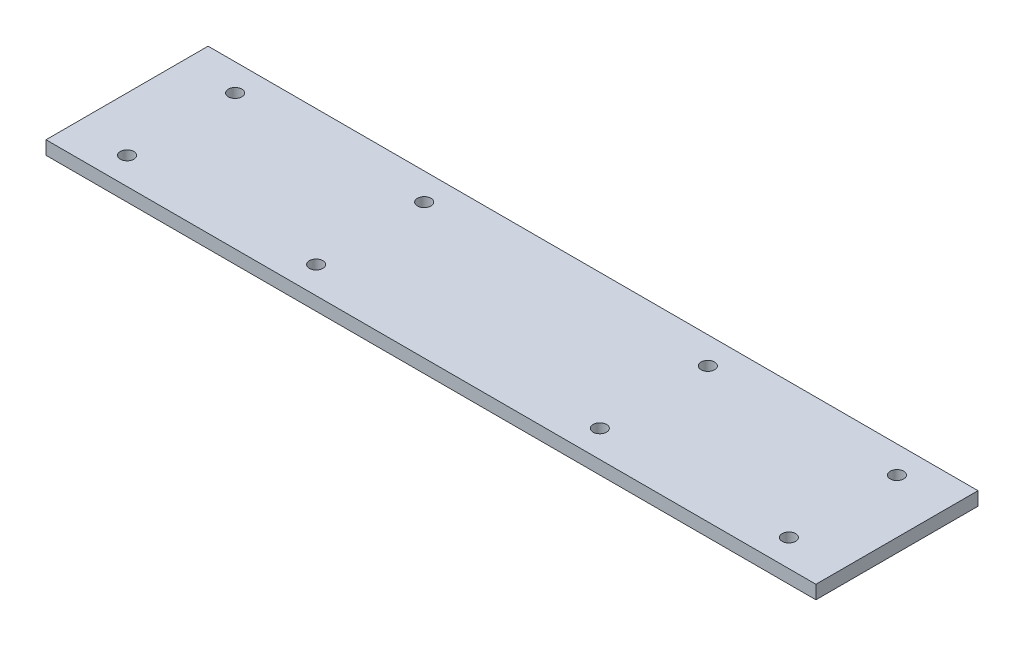
ISO-10303-21;
HEADER;
FILE_DESCRIPTION(('STEP AP214'),'2;1');
FILE_NAME('part.step','',(''),(''),'','','');
FILE_SCHEMA(('AUTOMOTIVE_DESIGN { 1 0 10303 214 1 1 1 1 }'));
ENDSEC;
DATA;
#1=APPLICATION_CONTEXT('core data for automotive mechanical design processes');
#2=APPLICATION_PROTOCOL_DEFINITION('international standard','automotive_design',2000,#1);
#3=PRODUCT_CONTEXT('',#1,'mechanical');
#4=PRODUCT('Part','Part','',(#3));
#5=PRODUCT_RELATED_PRODUCT_CATEGORY('part','',(#4));
#6=PRODUCT_DEFINITION_FORMATION('','',#4);
#7=PRODUCT_DEFINITION_CONTEXT('part definition',#1,'design');
#8=PRODUCT_DEFINITION('design','',#6,#7);
#9=PRODUCT_DEFINITION_SHAPE('','',#8);
#10=(LENGTH_UNIT() NAMED_UNIT(*) SI_UNIT(.MILLI.,.METRE.));
#11=(NAMED_UNIT(*) PLANE_ANGLE_UNIT() SI_UNIT($,.RADIAN.));
#12=(NAMED_UNIT(*) SI_UNIT($,.STERADIAN.) SOLID_ANGLE_UNIT());
#13=UNCERTAINTY_MEASURE_WITH_UNIT(LENGTH_MEASURE(1.E-05),#10,'distance_accuracy_value','');
#14=(GEOMETRIC_REPRESENTATION_CONTEXT(3) GLOBAL_UNCERTAINTY_ASSIGNED_CONTEXT((#13)) GLOBAL_UNIT_ASSIGNED_CONTEXT((#10,
#11,#12)) REPRESENTATION_CONTEXT('',''));
#15=CARTESIAN_POINT('',(0.,0.,0.));
#16=DIRECTION('',(0.,0.,1.));
#17=DIRECTION('',(1.,0.,0.));
#18=AXIS2_PLACEMENT_3D('',#15,#16,#17);
#19=CARTESIAN_POINT('',(-295.598856053384,12.7,-152.4));
#20=DIRECTION('',(1.,0.,0.));
#21=DIRECTION('',(0.,0.,-1.));
#22=AXIS2_PLACEMENT_3D('',#19,#20,#21);
#23=PLANE('',#22);
#24=DIRECTION('',(0.,0.,1.));
#25=VECTOR('',#24,1.);
#26=CARTESIAN_POINT('',(-295.598856053384,0.,-152.4));
#27=LINE('',#26,#25);
#28=CARTESIAN_POINT('',(-295.598856053384,0.,-152.4));
#29=VERTEX_POINT('',#28);
#30=CARTESIAN_POINT('',(-295.598856053384,0.,0.));
#31=VERTEX_POINT('',#30);
#32=EDGE_CURVE('E100',#29,#31,#27,.T.);
#33=ORIENTED_EDGE('',*,*,#32,.T.);
#34=DIRECTION('',(0.,-1.,0.));
#35=VECTOR('',#34,1.);
#36=CARTESIAN_POINT('',(-295.598856053384,12.7,0.));
#37=LINE('',#36,#35);
#38=CARTESIAN_POINT('',(-295.598856053384,12.7,0.));
#39=VERTEX_POINT('',#38);
#40=EDGE_CURVE('E11',#39,#31,#37,.T.);
#41=ORIENTED_EDGE('',*,*,#40,.F.);
#42=DIRECTION('',(0.,0.,1.));
#43=VECTOR('',#42,1.);
#44=CARTESIAN_POINT('',(-295.598856053384,12.7,-152.4));
#45=LINE('',#44,#43);
#46=CARTESIAN_POINT('',(-295.598856053384,12.7,-152.4));
#47=VERTEX_POINT('',#46);
#48=EDGE_CURVE('E88',#47,#39,#45,.T.);
#49=ORIENTED_EDGE('',*,*,#48,.F.);
#50=DIRECTION('',(0.,-1.,0.));
#51=VECTOR('',#50,1.);
#52=CARTESIAN_POINT('',(-295.598856053384,12.7,-152.4));
#53=LINE('',#52,#51);
#54=EDGE_CURVE('E96',#47,#29,#53,.T.);
#55=ORIENTED_EDGE('',*,*,#54,.T.);
#56=EDGE_LOOP('',(#33,#41,#49,#55));
#57=FACE_BOUND('',#56,.T.);
#58=ADVANCED_FACE('F37',(#57),#23,.F.);
#59=CARTESIAN_POINT('',(-295.598856053384,12.7,0.));
#60=DIRECTION('',(0.,0.,-1.));
#61=DIRECTION('',(-1.,0.,0.));
#62=AXIS2_PLACEMENT_3D('',#59,#60,#61);
#63=PLANE('',#62);
#64=DIRECTION('',(1.,0.,0.));
#65=VECTOR('',#64,1.);
#66=CARTESIAN_POINT('',(-295.598856053384,0.,0.));
#67=LINE('',#66,#65);
#68=CARTESIAN_POINT('',(428.301143946616,0.,0.));
#69=VERTEX_POINT('',#68);
#70=EDGE_CURVE('E92',#31,#69,#67,.T.);
#71=ORIENTED_EDGE('',*,*,#70,.T.);
#72=DIRECTION('',(0.,-1.,0.));
#73=VECTOR('',#72,1.);
#74=CARTESIAN_POINT('',(428.301143946616,12.7,0.));
#75=LINE('',#74,#73);
#76=CARTESIAN_POINT('',(428.301143946616,12.7,0.));
#77=VERTEX_POINT('',#76);
#78=EDGE_CURVE('E45',#77,#69,#75,.T.);
#79=ORIENTED_EDGE('',*,*,#78,.F.);
#80=DIRECTION('',(1.,0.,0.));
#81=VECTOR('',#80,1.);
#82=CARTESIAN_POINT('',(-295.598856053384,12.7,0.));
#83=LINE('',#82,#81);
#84=EDGE_CURVE('E83',#39,#77,#83,.T.);
#85=ORIENTED_EDGE('',*,*,#84,.F.);
#86=ORIENTED_EDGE('',*,*,#40,.T.);
#87=EDGE_LOOP('',(#71,#79,#85,#86));
#88=FACE_BOUND('',#87,.T.);
#89=ADVANCED_FACE('F91',(#88),#63,.F.);
#90=CARTESIAN_POINT('',(428.301143946616,12.7,-152.4));
#91=DIRECTION('',(-1.,0.,0.));
#92=DIRECTION('',(0.,0.,1.));
#93=AXIS2_PLACEMENT_3D('',#90,#91,#92);
#94=PLANE('',#93);
#95=DIRECTION('',(0.,0.,-1.));
#96=VECTOR('',#95,1.);
#97=CARTESIAN_POINT('',(428.301143946616,0.,-152.4));
#98=LINE('',#97,#96);
#99=CARTESIAN_POINT('',(428.301143946616,0.,-152.4));
#100=VERTEX_POINT('',#99);
#101=EDGE_CURVE('E70',#69,#100,#98,.T.);
#102=ORIENTED_EDGE('',*,*,#101,.T.);
#103=DIRECTION('',(0.,-1.,0.));
#104=VECTOR('',#103,1.);
#105=CARTESIAN_POINT('',(428.301143946616,12.7,-152.4));
#106=LINE('',#105,#104);
#107=CARTESIAN_POINT('',(428.301143946616,12.7,-152.4));
#108=VERTEX_POINT('',#107);
#109=EDGE_CURVE('E93',#108,#100,#106,.T.);
#110=ORIENTED_EDGE('',*,*,#109,.F.);
#111=DIRECTION('',(0.,0.,-1.));
#112=VECTOR('',#111,1.);
#113=CARTESIAN_POINT('',(428.301143946616,12.7,-152.4));
#114=LINE('',#113,#112);
#115=EDGE_CURVE('E86',#77,#108,#114,.T.);
#116=ORIENTED_EDGE('',*,*,#115,.F.);
#117=ORIENTED_EDGE('',*,*,#78,.T.);
#118=EDGE_LOOP('',(#102,#110,#116,#117));
#119=FACE_BOUND('',#118,.T.);
#120=ADVANCED_FACE('F94',(#119),#94,.F.);
#121=CARTESIAN_POINT('',(-295.598856053384,12.7,-152.4));
#122=DIRECTION('',(0.,0.,1.));
#123=DIRECTION('',(1.,0.,0.));
#124=AXIS2_PLACEMENT_3D('',#121,#122,#123);
#125=PLANE('',#124);
#126=DIRECTION('',(-1.,0.,0.));
#127=VECTOR('',#126,1.);
#128=CARTESIAN_POINT('',(-295.598856053384,0.,-152.4));
#129=LINE('',#128,#127);
#130=EDGE_CURVE('E76',#100,#29,#129,.T.);
#131=ORIENTED_EDGE('',*,*,#130,.T.);
#132=ORIENTED_EDGE('',*,*,#54,.F.);
#133=DIRECTION('',(-1.,0.,0.));
#134=VECTOR('',#133,1.);
#135=CARTESIAN_POINT('',(-295.598856053384,12.7,-152.4));
#136=LINE('',#135,#134);
#137=EDGE_CURVE('E53',#108,#47,#136,.T.);
#138=ORIENTED_EDGE('',*,*,#137,.F.);
#139=ORIENTED_EDGE('',*,*,#109,.T.);
#140=EDGE_LOOP('',(#131,#132,#138,#139));
#141=FACE_BOUND('',#140,.T.);
#142=ADVANCED_FACE('F108',(#141),#125,.F.);
#143=CARTESIAN_POINT('',(0.,12.7,0.));
#144=DIRECTION('',(0.,1.,0.));
#145=DIRECTION('',(0.,0.,1.));
#146=AXIS2_PLACEMENT_3D('',#143,#144,#145);
#147=PLANE('',#146);
#148=CARTESIAN_POINT('',(-244.798856053384,12.7,-127.));
#149=DIRECTION('',(0.,1.,0.));
#150=DIRECTION('',(0.,0.,-1.));
#151=AXIS2_PLACEMENT_3D('',#148,#149,#150);
#152=CIRCLE('',#151,6.34999999999994);
#153=CARTESIAN_POINT('',(-244.798856053384,12.7,-133.35));
#154=VERTEX_POINT('',#153);
#155=EDGE_CURVE('E132',#154,#154,#152,.T.);
#156=ORIENTED_EDGE('',*,*,#155,.F.);
#157=EDGE_LOOP('',(#156));
#158=FACE_BOUND('',#157,.T.);
#159=CARTESIAN_POINT('',(199.701143946616,12.7,-25.4));
#160=DIRECTION('',(0.,1.,0.));
#161=DIRECTION('',(0.,0.,1.));
#162=AXIS2_PLACEMENT_3D('',#159,#160,#161);
#163=CIRCLE('',#162,6.35);
#164=CARTESIAN_POINT('',(199.701143946616,12.7,-19.05));
#165=VERTEX_POINT('',#164);
#166=EDGE_CURVE('E139',#165,#165,#163,.T.);
#167=ORIENTED_EDGE('',*,*,#166,.F.);
#168=EDGE_LOOP('',(#167));
#169=FACE_BOUND('',#168,.T.);
#170=CARTESIAN_POINT('',(199.701143946616,12.7,-127.));
#171=DIRECTION('',(0.,1.,0.));
#172=DIRECTION('',(0.,0.,1.));
#173=AXIS2_PLACEMENT_3D('',#170,#171,#172);
#174=CIRCLE('',#173,6.34999999999994);
#175=CARTESIAN_POINT('',(199.701143946616,12.7,-120.65));
#176=VERTEX_POINT('',#175);
#177=EDGE_CURVE('E120',#176,#176,#174,.T.);
#178=ORIENTED_EDGE('',*,*,#177,.F.);
#179=EDGE_LOOP('',(#178));
#180=FACE_BOUND('',#179,.T.);
#181=CARTESIAN_POINT('',(377.501143946616,12.7,-25.4));
#182=DIRECTION('',(0.,1.,0.));
#183=DIRECTION('',(0.,0.,1.));
#184=AXIS2_PLACEMENT_3D('',#181,#182,#183);
#185=CIRCLE('',#184,6.35);
#186=CARTESIAN_POINT('',(377.501143946616,12.7,-19.05));
#187=VERTEX_POINT('',#186);
#188=EDGE_CURVE('E127',#187,#187,#185,.T.);
#189=ORIENTED_EDGE('',*,*,#188,.F.);
#190=EDGE_LOOP('',(#189));
#191=FACE_BOUND('',#190,.T.);
#192=CARTESIAN_POINT('',(-66.9988560533842,12.7,-25.4));
#193=DIRECTION('',(0.,1.,0.));
#194=DIRECTION('',(0.,0.,-1.));
#195=AXIS2_PLACEMENT_3D('',#192,#193,#194);
#196=CIRCLE('',#195,6.35);
#197=CARTESIAN_POINT('',(-66.9988560533842,12.7,-31.75));
#198=VERTEX_POINT('',#197);
#199=EDGE_CURVE('E156',#198,#198,#196,.T.);
#200=ORIENTED_EDGE('',*,*,#199,.F.);
#201=EDGE_LOOP('',(#200));
#202=FACE_BOUND('',#201,.T.);
#203=CARTESIAN_POINT('',(-244.798856053384,12.7,-25.3999999999999));
#204=DIRECTION('',(0.,1.,0.));
#205=DIRECTION('',(0.,0.,-1.));
#206=AXIS2_PLACEMENT_3D('',#203,#204,#205);
#207=CIRCLE('',#206,6.35);
#208=CARTESIAN_POINT('',(-244.798856053384,12.7,-31.7499999999999));
#209=VERTEX_POINT('',#208);
#210=EDGE_CURVE('E144',#209,#209,#207,.T.);
#211=ORIENTED_EDGE('',*,*,#210,.F.);
#212=EDGE_LOOP('',(#211));
#213=FACE_BOUND('',#212,.T.);
#214=CARTESIAN_POINT('',(-66.9988560533842,12.7,-127.));
#215=DIRECTION('',(0.,1.,0.));
#216=DIRECTION('',(0.,0.,-1.));
#217=AXIS2_PLACEMENT_3D('',#214,#215,#216);
#218=CIRCLE('',#217,6.34999999999995);
#219=CARTESIAN_POINT('',(-66.9988560533842,12.7,-133.35));
#220=VERTEX_POINT('',#219);
#221=EDGE_CURVE('E151',#220,#220,#218,.T.);
#222=ORIENTED_EDGE('',*,*,#221,.F.);
#223=EDGE_LOOP('',(#222));
#224=FACE_BOUND('',#223,.T.);
#225=CARTESIAN_POINT('',(377.501143946616,12.7,-127.));
#226=DIRECTION('',(0.,1.,0.));
#227=DIRECTION('',(0.,0.,1.));
#228=AXIS2_PLACEMENT_3D('',#225,#226,#227);
#229=CIRCLE('',#228,6.34999999999999);
#230=CARTESIAN_POINT('',(377.501143946616,12.7,-120.65));
#231=VERTEX_POINT('',#230);
#232=EDGE_CURVE('E114',#231,#231,#229,.T.);
#233=ORIENTED_EDGE('',*,*,#232,.F.);
#234=EDGE_LOOP('',(#233));
#235=FACE_BOUND('',#234,.T.);
#236=ORIENTED_EDGE('',*,*,#48,.T.);
#237=ORIENTED_EDGE('',*,*,#84,.T.);
#238=ORIENTED_EDGE('',*,*,#115,.T.);
#239=ORIENTED_EDGE('',*,*,#137,.T.);
#240=EDGE_LOOP('',(#236,#237,#238,#239));
#241=FACE_BOUND('',#240,.T.);
#242=ADVANCED_FACE('F84',(#158,#169,#180,#191,#202,#213,#224,#235,#241),#147,.T.);
#243=CARTESIAN_POINT('',(0.,0.,0.));
#244=DIRECTION('',(0.,1.,0.));
#245=DIRECTION('',(0.,0.,1.));
#246=AXIS2_PLACEMENT_3D('',#243,#244,#245);
#247=PLANE('',#246);
#248=CARTESIAN_POINT('',(-244.798856053384,0.,-127.));
#249=DIRECTION('',(0.,1.,0.));
#250=DIRECTION('',(0.,0.,-1.));
#251=AXIS2_PLACEMENT_3D('',#248,#249,#250);
#252=CIRCLE('',#251,6.34999999999994);
#253=CARTESIAN_POINT('',(-244.798856053384,0.,-133.35));
#254=VERTEX_POINT('',#253);
#255=EDGE_CURVE('E135',#254,#254,#252,.T.);
#256=ORIENTED_EDGE('',*,*,#255,.T.);
#257=EDGE_LOOP('',(#256));
#258=FACE_BOUND('',#257,.T.);
#259=CARTESIAN_POINT('',(199.701143946616,0.,-25.4));
#260=DIRECTION('',(0.,1.,0.));
#261=DIRECTION('',(0.,0.,1.));
#262=AXIS2_PLACEMENT_3D('',#259,#260,#261);
#263=CIRCLE('',#262,6.35);
#264=CARTESIAN_POINT('',(199.701143946616,0.,-19.05));
#265=VERTEX_POINT('',#264);
#266=EDGE_CURVE('E124',#265,#265,#263,.T.);
#267=ORIENTED_EDGE('',*,*,#266,.T.);
#268=EDGE_LOOP('',(#267));
#269=FACE_BOUND('',#268,.T.);
#270=CARTESIAN_POINT('',(199.701143946616,0.,-127.));
#271=DIRECTION('',(0.,1.,0.));
#272=DIRECTION('',(0.,0.,1.));
#273=AXIS2_PLACEMENT_3D('',#270,#271,#272);
#274=CIRCLE('',#273,6.34999999999994);
#275=CARTESIAN_POINT('',(199.701143946616,0.,-120.65));
#276=VERTEX_POINT('',#275);
#277=EDGE_CURVE('E123',#276,#276,#274,.T.);
#278=ORIENTED_EDGE('',*,*,#277,.T.);
#279=EDGE_LOOP('',(#278));
#280=FACE_BOUND('',#279,.T.);
#281=CARTESIAN_POINT('',(377.501143946616,0.,-25.4));
#282=DIRECTION('',(0.,1.,0.));
#283=DIRECTION('',(0.,0.,1.));
#284=AXIS2_PLACEMENT_3D('',#281,#282,#283);
#285=CIRCLE('',#284,6.35);
#286=CARTESIAN_POINT('',(377.501143946616,0.,-19.05));
#287=VERTEX_POINT('',#286);
#288=EDGE_CURVE('E117',#287,#287,#285,.T.);
#289=ORIENTED_EDGE('',*,*,#288,.T.);
#290=EDGE_LOOP('',(#289));
#291=FACE_BOUND('',#290,.T.);
#292=CARTESIAN_POINT('',(-66.9988560533842,0.,-25.4));
#293=DIRECTION('',(0.,1.,0.));
#294=DIRECTION('',(0.,0.,-1.));
#295=AXIS2_PLACEMENT_3D('',#292,#293,#294);
#296=CIRCLE('',#295,6.35);
#297=CARTESIAN_POINT('',(-66.9988560533842,0.,-31.75));
#298=VERTEX_POINT('',#297);
#299=EDGE_CURVE('E148',#298,#298,#296,.T.);
#300=ORIENTED_EDGE('',*,*,#299,.T.);
#301=EDGE_LOOP('',(#300));
#302=FACE_BOUND('',#301,.T.);
#303=CARTESIAN_POINT('',(-244.798856053384,0.,-25.3999999999999));
#304=DIRECTION('',(0.,1.,0.));
#305=DIRECTION('',(0.,0.,-1.));
#306=AXIS2_PLACEMENT_3D('',#303,#304,#305);
#307=CIRCLE('',#306,6.35);
#308=CARTESIAN_POINT('',(-244.798856053384,0.,-31.7499999999999));
#309=VERTEX_POINT('',#308);
#310=EDGE_CURVE('E147',#309,#309,#307,.T.);
#311=ORIENTED_EDGE('',*,*,#310,.T.);
#312=EDGE_LOOP('',(#311));
#313=FACE_BOUND('',#312,.T.);
#314=CARTESIAN_POINT('',(-66.9988560533842,0.,-127.));
#315=DIRECTION('',(0.,1.,0.));
#316=DIRECTION('',(0.,0.,-1.));
#317=AXIS2_PLACEMENT_3D('',#314,#315,#316);
#318=CIRCLE('',#317,6.34999999999995);
#319=CARTESIAN_POINT('',(-66.9988560533842,0.,-133.35));
#320=VERTEX_POINT('',#319);
#321=EDGE_CURVE('E136',#320,#320,#318,.T.);
#322=ORIENTED_EDGE('',*,*,#321,.T.);
#323=EDGE_LOOP('',(#322));
#324=FACE_BOUND('',#323,.T.);
#325=CARTESIAN_POINT('',(377.501143946616,0.,-127.));
#326=DIRECTION('',(0.,1.,0.));
#327=DIRECTION('',(0.,0.,1.));
#328=AXIS2_PLACEMENT_3D('',#325,#326,#327);
#329=CIRCLE('',#328,6.34999999999999);
#330=CARTESIAN_POINT('',(377.501143946616,0.,-120.65));
#331=VERTEX_POINT('',#330);
#332=EDGE_CURVE('E103',#331,#331,#329,.T.);
#333=ORIENTED_EDGE('',*,*,#332,.T.);
#334=EDGE_LOOP('',(#333));
#335=FACE_BOUND('',#334,.T.);
#336=ORIENTED_EDGE('',*,*,#32,.F.);
#337=ORIENTED_EDGE('',*,*,#130,.F.);
#338=ORIENTED_EDGE('',*,*,#101,.F.);
#339=ORIENTED_EDGE('',*,*,#70,.F.);
#340=EDGE_LOOP('',(#336,#337,#338,#339));
#341=FACE_BOUND('',#340,.T.);
#342=ADVANCED_FACE('F111',(#258,#269,#280,#291,#302,#313,#324,#335,#341),#247,.F.);
#343=CARTESIAN_POINT('',(377.501143946616,0.,-127.));
#344=DIRECTION('',(0.,1.,0.));
#345=DIRECTION('',(0.,0.,1.));
#346=AXIS2_PLACEMENT_3D('',#343,#344,#345);
#347=CYLINDRICAL_SURFACE('',#346,6.34999999999999);
#348=ORIENTED_EDGE('',*,*,#332,.F.);
#349=EDGE_LOOP('',(#348));
#350=FACE_BOUND('',#349,.T.);
#351=ORIENTED_EDGE('',*,*,#232,.T.);
#352=EDGE_LOOP('',(#351));
#353=FACE_BOUND('',#352,.T.);
#354=ADVANCED_FACE('F182',(#350,#353),#347,.F.);
#355=CARTESIAN_POINT('',(-66.9988560533842,0.,-127.));
#356=DIRECTION('',(0.,1.,0.));
#357=DIRECTION('',(0.,0.,1.));
#358=AXIS2_PLACEMENT_3D('',#355,#356,#357);
#359=CYLINDRICAL_SURFACE('',#358,6.34999999999995);
#360=ORIENTED_EDGE('',*,*,#321,.F.);
#361=EDGE_LOOP('',(#360));
#362=FACE_BOUND('',#361,.T.);
#363=ORIENTED_EDGE('',*,*,#221,.T.);
#364=EDGE_LOOP('',(#363));
#365=FACE_BOUND('',#364,.T.);
#366=ADVANCED_FACE('F184',(#362,#365),#359,.F.);
#367=CARTESIAN_POINT('',(-244.798856053384,0.,-25.3999999999999));
#368=DIRECTION('',(0.,1.,0.));
#369=DIRECTION('',(0.,0.,1.));
#370=AXIS2_PLACEMENT_3D('',#367,#368,#369);
#371=CYLINDRICAL_SURFACE('',#370,6.35);
#372=ORIENTED_EDGE('',*,*,#310,.F.);
#373=EDGE_LOOP('',(#372));
#374=FACE_BOUND('',#373,.T.);
#375=ORIENTED_EDGE('',*,*,#210,.T.);
#376=EDGE_LOOP('',(#375));
#377=FACE_BOUND('',#376,.T.);
#378=ADVANCED_FACE('F168',(#374,#377),#371,.F.);
#379=CARTESIAN_POINT('',(-66.9988560533842,0.,-25.4));
#380=DIRECTION('',(0.,1.,0.));
#381=DIRECTION('',(0.,0.,1.));
#382=AXIS2_PLACEMENT_3D('',#379,#380,#381);
#383=CYLINDRICAL_SURFACE('',#382,6.35);
#384=ORIENTED_EDGE('',*,*,#299,.F.);
#385=EDGE_LOOP('',(#384));
#386=FACE_BOUND('',#385,.T.);
#387=ORIENTED_EDGE('',*,*,#199,.T.);
#388=EDGE_LOOP('',(#387));
#389=FACE_BOUND('',#388,.T.);
#390=ADVANCED_FACE('F164',(#386,#389),#383,.F.);
#391=CARTESIAN_POINT('',(377.501143946616,0.,-25.4));
#392=DIRECTION('',(0.,1.,0.));
#393=DIRECTION('',(0.,0.,1.));
#394=AXIS2_PLACEMENT_3D('',#391,#392,#393);
#395=CYLINDRICAL_SURFACE('',#394,6.35);
#396=ORIENTED_EDGE('',*,*,#288,.F.);
#397=EDGE_LOOP('',(#396));
#398=FACE_BOUND('',#397,.T.);
#399=ORIENTED_EDGE('',*,*,#188,.T.);
#400=EDGE_LOOP('',(#399));
#401=FACE_BOUND('',#400,.T.);
#402=ADVANCED_FACE('F167',(#398,#401),#395,.F.);
#403=CARTESIAN_POINT('',(199.701143946616,0.,-127.));
#404=DIRECTION('',(0.,1.,0.));
#405=DIRECTION('',(0.,0.,1.));
#406=AXIS2_PLACEMENT_3D('',#403,#404,#405);
#407=CYLINDRICAL_SURFACE('',#406,6.34999999999994);
#408=ORIENTED_EDGE('',*,*,#277,.F.);
#409=EDGE_LOOP('',(#408));
#410=FACE_BOUND('',#409,.T.);
#411=ORIENTED_EDGE('',*,*,#177,.T.);
#412=EDGE_LOOP('',(#411));
#413=FACE_BOUND('',#412,.T.);
#414=ADVANCED_FACE('F253',(#410,#413),#407,.F.);
#415=CARTESIAN_POINT('',(199.701143946616,0.,-25.4));
#416=DIRECTION('',(0.,1.,0.));
#417=DIRECTION('',(0.,0.,1.));
#418=AXIS2_PLACEMENT_3D('',#415,#416,#417);
#419=CYLINDRICAL_SURFACE('',#418,6.35);
#420=ORIENTED_EDGE('',*,*,#266,.F.);
#421=EDGE_LOOP('',(#420));
#422=FACE_BOUND('',#421,.T.);
#423=ORIENTED_EDGE('',*,*,#166,.T.);
#424=EDGE_LOOP('',(#423));
#425=FACE_BOUND('',#424,.T.);
#426=ADVANCED_FACE('F263',(#422,#425),#419,.F.);
#427=CARTESIAN_POINT('',(-244.798856053384,0.,-127.));
#428=DIRECTION('',(0.,1.,0.));
#429=DIRECTION('',(0.,0.,1.));
#430=AXIS2_PLACEMENT_3D('',#427,#428,#429);
#431=CYLINDRICAL_SURFACE('',#430,6.34999999999994);
#432=ORIENTED_EDGE('',*,*,#255,.F.);
#433=EDGE_LOOP('',(#432));
#434=FACE_BOUND('',#433,.T.);
#435=ORIENTED_EDGE('',*,*,#155,.T.);
#436=EDGE_LOOP('',(#435));
#437=FACE_BOUND('',#436,.T.);
#438=ADVANCED_FACE('F272',(#434,#437),#431,.F.);
#439=CLOSED_SHELL('',(#58,#89,#120,#142,#242,#342,#354,#366,#378,#390,#402,#414,#426,#438));
#440=MANIFOLD_SOLID_BREP('B2',#439);
#441=ADVANCED_BREP_SHAPE_REPRESENTATION('',(#18,#440),#14);
#442=SHAPE_DEFINITION_REPRESENTATION(#9,#441);
ENDSEC;
END-ISO-10303-21;
